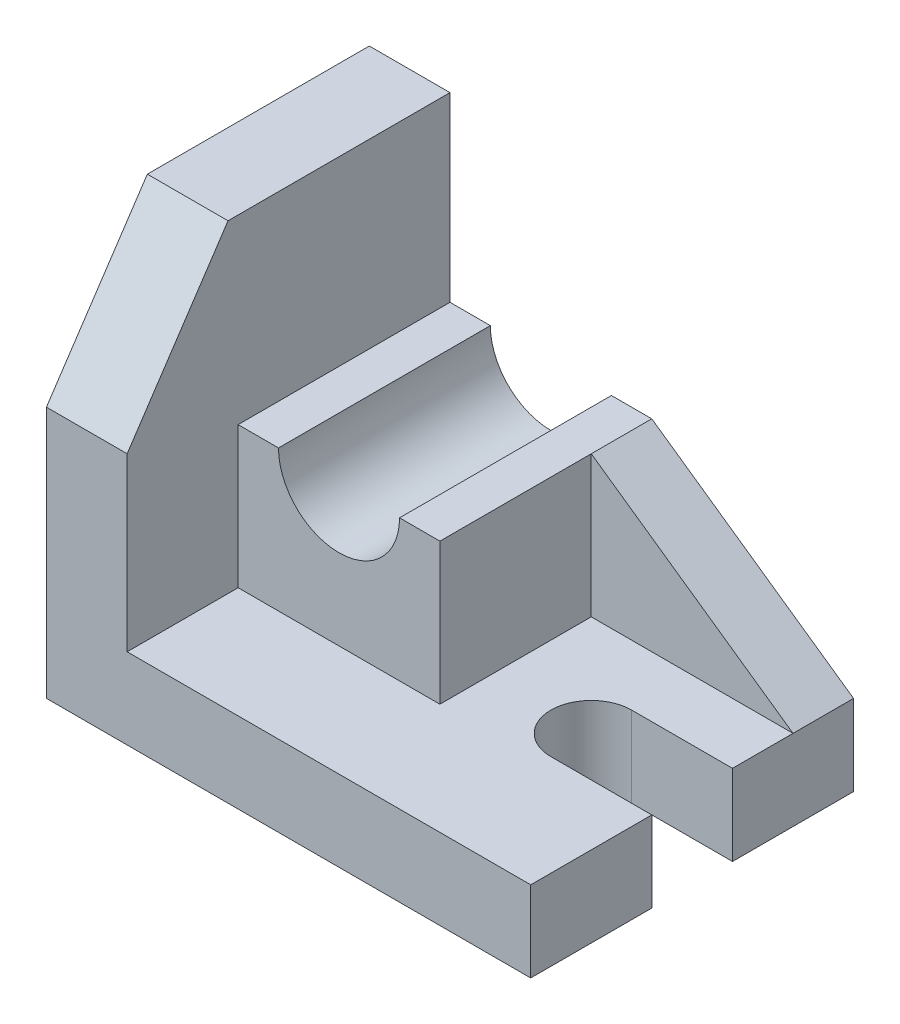
ISO-10303-21;
HEADER;
FILE_DESCRIPTION(('STEP AP214'),'2;1');
FILE_NAME('part.step','',(''),(''),'','','');
FILE_SCHEMA(('AUTOMOTIVE_DESIGN { 1 0 10303 214 1 1 1 1 }'));
ENDSEC;
DATA;
#1=APPLICATION_CONTEXT('core data for automotive mechanical design processes');
#2=APPLICATION_PROTOCOL_DEFINITION('international standard','automotive_design',2000,#1);
#3=PRODUCT_CONTEXT('',#1,'mechanical');
#4=PRODUCT('Part','Part','',(#3));
#5=PRODUCT_RELATED_PRODUCT_CATEGORY('part','',(#4));
#6=PRODUCT_DEFINITION_FORMATION('','',#4);
#7=PRODUCT_DEFINITION_CONTEXT('part definition',#1,'design');
#8=PRODUCT_DEFINITION('design','',#6,#7);
#9=PRODUCT_DEFINITION_SHAPE('','',#8);
#10=(LENGTH_UNIT() NAMED_UNIT(*) SI_UNIT(.MILLI.,.METRE.));
#11=(NAMED_UNIT(*) PLANE_ANGLE_UNIT() SI_UNIT($,.RADIAN.));
#12=(NAMED_UNIT(*) SI_UNIT($,.STERADIAN.) SOLID_ANGLE_UNIT());
#13=UNCERTAINTY_MEASURE_WITH_UNIT(LENGTH_MEASURE(1.E-05),#10,'distance_accuracy_value','');
#14=(GEOMETRIC_REPRESENTATION_CONTEXT(3) GLOBAL_UNCERTAINTY_ASSIGNED_CONTEXT((#13)) GLOBAL_UNIT_ASSIGNED_CONTEXT((#10,
#11,#12)) REPRESENTATION_CONTEXT('',''));
#15=CARTESIAN_POINT('',(0.,0.,0.));
#16=DIRECTION('',(0.,0.,1.));
#17=DIRECTION('',(1.,0.,0.));
#18=AXIS2_PLACEMENT_3D('',#15,#16,#17);
#19=CARTESIAN_POINT('',(0.,16.,0.));
#20=DIRECTION('',(0.,-1.,0.));
#21=DIRECTION('',(0.,0.,-1.));
#22=AXIS2_PLACEMENT_3D('',#19,#20,#21);
#23=PLANE('',#22);
#24=DIRECTION('',(-1.,0.,0.));
#25=VECTOR('',#24,1.);
#26=CARTESIAN_POINT('',(-17.2205345771136,16.,-19.3610159427443));
#27=LINE('',#26,#25);
#28=CARTESIAN_POINT('',(22.7794654228864,16.,-19.3610159427443));
#29=VERTEX_POINT('',#28);
#30=CARTESIAN_POINT('',(-17.2205345771136,16.,-19.3610159427443));
#31=VERTEX_POINT('',#30);
#32=EDGE_CURVE('E168',#29,#31,#27,.T.);
#33=ORIENTED_EDGE('',*,*,#32,.T.);
#34=DIRECTION('',(0.,0.,-1.));
#35=VECTOR('',#34,1.);
#36=CARTESIAN_POINT('',(-17.2205345771136,16.,10.6389840572557));
#37=LINE('',#36,#35);
#38=CARTESIAN_POINT('',(-17.2205345771136,16.,10.6389840572557));
#39=VERTEX_POINT('',#38);
#40=EDGE_CURVE('E180',#39,#31,#37,.T.);
#41=ORIENTED_EDGE('',*,*,#40,.F.);
#42=DIRECTION('',(-1.,0.,0.));
#43=VECTOR('',#42,1.);
#44=CARTESIAN_POINT('',(-17.2205345771136,16.,10.6389840572557));
#45=LINE('',#44,#43);
#46=CARTESIAN_POINT('',(-57.2205345771136,16.,10.6389840572557));
#47=VERTEX_POINT('',#46);
#48=EDGE_CURVE('E319',#39,#47,#45,.T.);
#49=ORIENTED_EDGE('',*,*,#48,.T.);
#50=DIRECTION('',(0.,0.,1.));
#51=VECTOR('',#50,1.);
#52=CARTESIAN_POINT('',(-57.2205345771136,16.,-31.3610159427443));
#53=LINE('',#52,#51);
#54=CARTESIAN_POINT('',(-57.2205345771136,16.,32.6389840572558));
#55=VERTEX_POINT('',#54);
#56=EDGE_CURVE('E203',#47,#55,#53,.T.);
#57=ORIENTED_EDGE('',*,*,#56,.T.);
#58=DIRECTION('',(1.,0.,0.));
#59=VECTOR('',#58,1.);
#60=CARTESIAN_POINT('',(22.7794654228864,16.,32.6389840572557));
#61=LINE('',#60,#59);
#62=CARTESIAN_POINT('',(22.7794654228864,16.,32.6389840572557));
#63=VERTEX_POINT('',#62);
#64=EDGE_CURVE('E247',#55,#63,#61,.T.);
#65=ORIENTED_EDGE('',*,*,#64,.T.);
#66=DIRECTION('',(0.,0.,-1.));
#67=VECTOR('',#66,1.);
#68=CARTESIAN_POINT('',(22.7794654228864,16.,-31.3610159427443));
#69=LINE('',#68,#67);
#70=CARTESIAN_POINT('',(22.7794654228864,16.,8.63898405725575));
#71=VERTEX_POINT('',#70);
#72=EDGE_CURVE('E250',#63,#71,#69,.T.);
#73=ORIENTED_EDGE('',*,*,#72,.T.);
#74=DIRECTION('',(1.,0.,0.));
#75=VECTOR('',#74,1.);
#76=CARTESIAN_POINT('',(22.7794654228864,16.,8.63898405725575));
#77=LINE('',#76,#75);
#78=CARTESIAN_POINT('',(2.77946542288637,16.,8.63898405725575));
#79=VERTEX_POINT('',#78);
#80=EDGE_CURVE('E225',#79,#71,#77,.T.);
#81=ORIENTED_EDGE('',*,*,#80,.F.);
#82=CARTESIAN_POINT('',(2.77946542288636,16.,0.63898405725575));
#83=DIRECTION('',(0.,1.,0.));
#84=DIRECTION('',(0.,0.,1.));
#85=AXIS2_PLACEMENT_3D('',#82,#83,#84);
#86=CIRCLE('',#85,8.);
#87=CARTESIAN_POINT('',(2.77946542288637,16.,-7.36101594274425));
#88=VERTEX_POINT('',#87);
#89=EDGE_CURVE('E234',#88,#79,#86,.T.);
#90=ORIENTED_EDGE('',*,*,#89,.F.);
#91=DIRECTION('',(-1.,0.,0.));
#92=VECTOR('',#91,1.);
#93=CARTESIAN_POINT('',(22.7794654228864,16.,-7.36101594274425));
#94=LINE('',#93,#92);
#95=CARTESIAN_POINT('',(22.7794654228864,16.,-7.36101594274425));
#96=VERTEX_POINT('',#95);
#97=EDGE_CURVE('E218',#96,#88,#94,.T.);
#98=ORIENTED_EDGE('',*,*,#97,.F.);
#99=EDGE_CURVE('E183',#96,#29,#69,.T.);
#100=ORIENTED_EDGE('',*,*,#99,.T.);
#101=EDGE_LOOP('',(#33,#41,#49,#57,#65,#73,#81,#90,#98,#100));
#102=FACE_BOUND('',#101,.T.);
#103=ADVANCED_FACE('F39',(#102),#23,.F.);
#104=CARTESIAN_POINT('',(-17.2205345771136,44.,10.6389840572557));
#105=DIRECTION('',(1.,0.,0.));
#106=DIRECTION('',(0.,1.,0.));
#107=AXIS2_PLACEMENT_3D('',#104,#105,#106);
#108=PLANE('',#107);
#109=ORIENTED_EDGE('',*,*,#40,.T.);
#110=DIRECTION('',(0.,1.,0.));
#111=VECTOR('',#110,1.);
#112=CARTESIAN_POINT('',(-17.2205345771136,44.,-19.3610159427443));
#113=LINE('',#112,#111);
#114=CARTESIAN_POINT('',(-17.2205345771136,44.,-19.3610159427443));
#115=VERTEX_POINT('',#114);
#116=EDGE_CURVE('E165',#31,#115,#113,.T.);
#117=ORIENTED_EDGE('',*,*,#116,.T.);
#118=DIRECTION('',(0.,0.,-1.));
#119=VECTOR('',#118,1.);
#120=CARTESIAN_POINT('',(-17.2205345771136,44.,10.6389840572557));
#121=LINE('',#120,#119);
#122=CARTESIAN_POINT('',(-17.2205345771136,44.,10.6389840572557));
#123=VERTEX_POINT('',#122);
#124=EDGE_CURVE('E191',#123,#115,#121,.T.);
#125=ORIENTED_EDGE('',*,*,#124,.F.);
#126=DIRECTION('',(0.,-1.,0.));
#127=VECTOR('',#126,1.);
#128=CARTESIAN_POINT('',(-17.2205345771136,44.,10.6389840572557));
#129=LINE('',#128,#127);
#130=EDGE_CURVE('E189',#123,#39,#129,.T.);
#131=ORIENTED_EDGE('',*,*,#130,.T.);
#132=EDGE_LOOP('',(#109,#117,#125,#131));
#133=FACE_BOUND('',#132,.T.);
#134=ADVANCED_FACE('F187',(#133),#108,.T.);
#135=CARTESIAN_POINT('',(-57.2205345771136,44.,10.6389840572557));
#136=DIRECTION('',(0.,1.,0.));
#137=DIRECTION('',(-1.,0.,0.));
#138=AXIS2_PLACEMENT_3D('',#135,#136,#137);
#139=PLANE('',#138);
#140=DIRECTION('',(0.,0.,1.));
#141=VECTOR('',#140,1.);
#142=CARTESIAN_POINT('',(-49.2205345771136,44.,-31.3610159427443));
#143=LINE('',#142,#141);
#144=CARTESIAN_POINT('',(-49.2205345771136,44.,-31.3610159427443));
#145=VERTEX_POINT('',#144);
#146=CARTESIAN_POINT('',(-49.2205345771136,44.,10.6389840572557));
#147=VERTEX_POINT('',#146);
#148=EDGE_CURVE('E55',#145,#147,#143,.T.);
#149=ORIENTED_EDGE('',*,*,#148,.F.);
#150=DIRECTION('',(1.,0.,0.));
#151=VECTOR('',#150,1.);
#152=CARTESIAN_POINT('',(-57.2205345771136,44.,-31.3610159427443));
#153=LINE('',#152,#151);
#154=CARTESIAN_POINT('',(-57.2205345771136,44.,-31.3610159427443));
#155=VERTEX_POINT('',#154);
#156=EDGE_CURVE('E198',#155,#145,#153,.T.);
#157=ORIENTED_EDGE('',*,*,#156,.F.);
#158=DIRECTION('',(0.,0.,-1.));
#159=VECTOR('',#158,1.);
#160=CARTESIAN_POINT('',(-57.2205345771136,44.,10.6389840572557));
#161=LINE('',#160,#159);
#162=CARTESIAN_POINT('',(-57.2205345771136,44.,10.6389840572557));
#163=VERTEX_POINT('',#162);
#164=EDGE_CURVE('E195',#163,#155,#161,.T.);
#165=ORIENTED_EDGE('',*,*,#164,.F.);
#166=DIRECTION('',(1.,0.,0.));
#167=VECTOR('',#166,1.);
#168=CARTESIAN_POINT('',(-57.2205345771136,44.,10.6389840572557));
#169=LINE('',#168,#167);
#170=EDGE_CURVE('E325',#163,#147,#169,.T.);
#171=ORIENTED_EDGE('',*,*,#170,.T.);
#172=EDGE_LOOP('',(#149,#157,#165,#171));
#173=FACE_BOUND('',#172,.T.);
#174=ADVANCED_FACE('F374',(#173),#139,.T.);
#175=CARTESIAN_POINT('',(-57.2205345771136,0.,0.));
#176=DIRECTION('',(-1.,0.,0.));
#177=DIRECTION('',(0.,0.,1.));
#178=AXIS2_PLACEMENT_3D('',#175,#176,#177);
#179=PLANE('',#178);
#180=DIRECTION('',(0.,1.,0.));
#181=VECTOR('',#180,1.);
#182=CARTESIAN_POINT('',(-57.2205345771136,16.,10.6389840572557));
#183=LINE('',#182,#181);
#184=EDGE_CURVE('E320',#47,#163,#183,.T.);
#185=ORIENTED_EDGE('',*,*,#184,.T.);
#186=ORIENTED_EDGE('',*,*,#164,.T.);
#187=DIRECTION('',(0.,1.,0.));
#188=VECTOR('',#187,1.);
#189=CARTESIAN_POINT('',(-57.2205345771136,16.,-31.3610159427443));
#190=LINE('',#189,#188);
#191=CARTESIAN_POINT('',(-57.2205345771136,16.,-31.3610159427443));
#192=VERTEX_POINT('',#191);
#193=EDGE_CURVE('E331',#192,#155,#190,.T.);
#194=ORIENTED_EDGE('',*,*,#193,.F.);
#195=DIRECTION('',(0.,-0.999999999872065,1.59959319801477E-05));
#196=VECTOR('',#195,1.);
#197=CARTESIAN_POINT('',(-57.2205345771136,80.,-31.3620396823911));
#198=LINE('',#197,#196);
#199=CARTESIAN_POINT('',(-57.2205345771136,80.,-31.3620396823911));
#200=VERTEX_POINT('',#199);
#201=EDGE_CURVE('E210',#200,#192,#198,.T.);
#202=ORIENTED_EDGE('',*,*,#201,.F.);
#203=DIRECTION('',(0.,0.,-1.));
#204=VECTOR('',#203,1.);
#205=CARTESIAN_POINT('',(-57.2205345771136,80.,32.6389840572558));
#206=LINE('',#205,#204);
#207=CARTESIAN_POINT('',(-57.2205345771136,80.,12.6389840572557));
#208=VERTEX_POINT('',#207);
#209=EDGE_CURVE('E208',#208,#200,#206,.T.);
#210=ORIENTED_EDGE('',*,*,#209,.F.);
#211=DIRECTION('',(0.,-0.832050294337844,0.554700196225228));
#212=VECTOR('',#211,1.);
#213=CARTESIAN_POINT('',(-57.2205345771136,49.9999999999999,32.6389840572557));
#214=LINE('',#213,#212);
#215=CARTESIAN_POINT('',(-57.2205345771136,49.9999999999998,32.6389840572558));
#216=VERTEX_POINT('',#215);
#217=EDGE_CURVE('E48',#208,#216,#214,.T.);
#218=ORIENTED_EDGE('',*,*,#217,.T.);
#219=DIRECTION('',(0.,1.,0.));
#220=VECTOR('',#219,1.);
#221=CARTESIAN_POINT('',(-57.2205345771136,16.,32.6389840572558));
#222=LINE('',#221,#220);
#223=EDGE_CURVE('E205',#55,#216,#222,.T.);
#224=ORIENTED_EDGE('',*,*,#223,.F.);
#225=ORIENTED_EDGE('',*,*,#56,.F.);
#226=EDGE_LOOP('',(#185,#186,#194,#202,#210,#218,#224,#225));
#227=FACE_BOUND('',#226,.T.);
#228=ADVANCED_FACE('F282',(#227),#179,.F.);
#229=CARTESIAN_POINT('',(22.7794654228864,16.,-31.3610159427443));
#230=DIRECTION('',(-1.,0.,0.));
#231=DIRECTION('',(0.,0.,1.));
#232=AXIS2_PLACEMENT_3D('',#229,#230,#231);
#233=PLANE('',#232);
#234=DIRECTION('',(0.,0.,-1.));
#235=VECTOR('',#234,1.);
#236=CARTESIAN_POINT('',(22.7794654228864,0.,-31.3610159427443));
#237=LINE('',#236,#235);
#238=CARTESIAN_POINT('',(22.7794654228864,0.,32.6389840572557));
#239=VERTEX_POINT('',#238);
#240=CARTESIAN_POINT('',(22.7794654228864,0.,8.63898405725575));
#241=VERTEX_POINT('',#240);
#242=EDGE_CURVE('E259',#239,#241,#237,.T.);
#243=ORIENTED_EDGE('',*,*,#242,.T.);
#244=DIRECTION('',(0.,1.,0.));
#245=VECTOR('',#244,1.);
#246=CARTESIAN_POINT('',(22.7794654228864,0.,8.63898405725575));
#247=LINE('',#246,#245);
#248=EDGE_CURVE('E238',#241,#71,#247,.T.);
#249=ORIENTED_EDGE('',*,*,#248,.T.);
#250=ORIENTED_EDGE('',*,*,#72,.F.);
#251=DIRECTION('',(0.,-1.,0.));
#252=VECTOR('',#251,1.);
#253=CARTESIAN_POINT('',(22.7794654228864,16.,32.6389840572557));
#254=LINE('',#253,#252);
#255=EDGE_CURVE('E268',#63,#239,#254,.T.);
#256=ORIENTED_EDGE('',*,*,#255,.T.);
#257=EDGE_LOOP('',(#243,#249,#250,#256));
#258=FACE_BOUND('',#257,.T.);
#259=ADVANCED_FACE('F316',(#258),#233,.F.);
#260=CARTESIAN_POINT('',(-73.2205345771136,16.,32.6389840572558));
#261=DIRECTION('',(1.,0.,0.));
#262=DIRECTION('',(0.,0.,-1.));
#263=AXIS2_PLACEMENT_3D('',#260,#261,#262);
#264=PLANE('',#263);
#265=DIRECTION('',(0.,-1.,0.));
#266=VECTOR('',#265,1.);
#267=CARTESIAN_POINT('',(-73.2205345771136,16.,32.6389840572558));
#268=LINE('',#267,#266);
#269=CARTESIAN_POINT('',(-73.2205345771136,49.9999999999998,32.6389840572558));
#270=VERTEX_POINT('',#269);
#271=CARTESIAN_POINT('',(-73.2205345771136,0.,32.6389840572558));
#272=VERTEX_POINT('',#271);
#273=EDGE_CURVE('E271',#270,#272,#268,.T.);
#274=ORIENTED_EDGE('',*,*,#273,.F.);
#275=DIRECTION('',(0.,0.832050294337844,-0.554700196225228));
#276=VECTOR('',#275,1.);
#277=CARTESIAN_POINT('',(-73.2205345771136,49.9999999999999,32.6389840572557));
#278=LINE('',#277,#276);
#279=CARTESIAN_POINT('',(-73.2205345771136,80.,12.6389840572557));
#280=VERTEX_POINT('',#279);
#281=EDGE_CURVE('E276',#270,#280,#278,.T.);
#282=ORIENTED_EDGE('',*,*,#281,.T.);
#283=DIRECTION('',(0.,0.,-1.));
#284=VECTOR('',#283,1.);
#285=CARTESIAN_POINT('',(-73.2205345771136,80.,32.6389840572558));
#286=LINE('',#285,#284);
#287=CARTESIAN_POINT('',(-73.2205345771136,80.,-31.3620396823911));
#288=VERTEX_POINT('',#287);
#289=EDGE_CURVE('E190',#280,#288,#286,.T.);
#290=ORIENTED_EDGE('',*,*,#289,.T.);
#291=DIRECTION('',(0.,-0.999999999872065,1.59959319801477E-05));
#292=VECTOR('',#291,1.);
#293=CARTESIAN_POINT('',(-73.2205345771136,80.,-31.3620396823911));
#294=LINE('',#293,#292);
#295=CARTESIAN_POINT('',(-73.2205345771136,16.,-31.3610159427443));
#296=VERTEX_POINT('',#295);
#297=EDGE_CURVE('E193',#288,#296,#294,.T.);
#298=ORIENTED_EDGE('',*,*,#297,.T.);
#299=DIRECTION('',(0.,-1.,0.));
#300=VECTOR('',#299,1.);
#301=CARTESIAN_POINT('',(-73.2205345771136,16.,-31.3610159427443));
#302=LINE('',#301,#300);
#303=CARTESIAN_POINT('',(-73.2205345771136,0.,-31.3610159427443));
#304=VERTEX_POINT('',#303);
#305=EDGE_CURVE('E253',#296,#304,#302,.T.);
#306=ORIENTED_EDGE('',*,*,#305,.T.);
#307=DIRECTION('',(0.,0.,1.));
#308=VECTOR('',#307,1.);
#309=CARTESIAN_POINT('',(-73.2205345771136,0.,32.6389840572558));
#310=LINE('',#309,#308);
#311=EDGE_CURVE('E241',#304,#272,#310,.T.);
#312=ORIENTED_EDGE('',*,*,#311,.T.);
#313=EDGE_LOOP('',(#274,#282,#290,#298,#306,#312));
#314=FACE_BOUND('',#313,.T.);
#315=ADVANCED_FACE('F293',(#314),#264,.F.);
#316=CARTESIAN_POINT('',(22.7794654228864,16.,32.6389840572557));
#317=DIRECTION('',(0.,0.,-1.));
#318=DIRECTION('',(-1.,0.,0.));
#319=AXIS2_PLACEMENT_3D('',#316,#317,#318);
#320=PLANE('',#319);
#321=ORIENTED_EDGE('',*,*,#223,.T.);
#322=DIRECTION('',(-1.,0.,0.));
#323=VECTOR('',#322,1.);
#324=CARTESIAN_POINT('',(-73.2205345771136,49.9999999999998,32.6389840572558));
#325=LINE('',#324,#323);
#326=EDGE_CURVE('E273',#216,#270,#325,.T.);
#327=ORIENTED_EDGE('',*,*,#326,.T.);
#328=ORIENTED_EDGE('',*,*,#273,.T.);
#329=DIRECTION('',(1.,0.,0.));
#330=VECTOR('',#329,1.);
#331=CARTESIAN_POINT('',(22.7794654228864,0.,32.6389840572557));
#332=LINE('',#331,#330);
#333=EDGE_CURVE('E256',#272,#239,#332,.T.);
#334=ORIENTED_EDGE('',*,*,#333,.T.);
#335=ORIENTED_EDGE('',*,*,#255,.F.);
#336=ORIENTED_EDGE('',*,*,#64,.F.);
#337=EDGE_LOOP('',(#321,#327,#328,#334,#335,#336));
#338=FACE_BOUND('',#337,.T.);
#339=ADVANCED_FACE('F289',(#338),#320,.F.);
#340=ORIENTED_EDGE('',*,*,#99,.F.);
#341=DIRECTION('',(0.,1.,0.));
#342=VECTOR('',#341,1.);
#343=CARTESIAN_POINT('',(22.7794654228864,0.,-7.36101594274425));
#344=LINE('',#343,#342);
#345=CARTESIAN_POINT('',(22.7794654228864,0.,-7.36101594274425));
#346=VERTEX_POINT('',#345);
#347=EDGE_CURVE('E231',#346,#96,#344,.T.);
#348=ORIENTED_EDGE('',*,*,#347,.F.);
#349=CARTESIAN_POINT('',(22.7794654228864,0.,-31.3610159427443));
#350=VERTEX_POINT('',#349);
#351=EDGE_CURVE('E258',#346,#350,#237,.T.);
#352=ORIENTED_EDGE('',*,*,#351,.T.);
#353=DIRECTION('',(0.,-1.,0.));
#354=VECTOR('',#353,1.);
#355=CARTESIAN_POINT('',(22.7794654228864,16.,-31.3610159427443));
#356=LINE('',#355,#354);
#357=CARTESIAN_POINT('',(22.7794654228864,16.,-31.3610159427443));
#358=VERTEX_POINT('',#357);
#359=EDGE_CURVE('E265',#358,#350,#356,.T.);
#360=ORIENTED_EDGE('',*,*,#359,.F.);
#361=DIRECTION('',(0.,0.,-1.));
#362=VECTOR('',#361,1.);
#363=CARTESIAN_POINT('',(22.7794654228864,16.,-19.3610159427443));
#364=LINE('',#363,#362);
#365=EDGE_CURVE('E340',#29,#358,#364,.T.);
#366=ORIENTED_EDGE('',*,*,#365,.F.);
#367=EDGE_LOOP('',(#340,#348,#352,#360,#366));
#368=FACE_BOUND('',#367,.T.);
#369=ADVANCED_FACE('F350',(#368),#233,.F.);
#370=CARTESIAN_POINT('',(-73.2205345771136,16.,-31.3610159427443));
#371=DIRECTION('',(0.,0.,1.));
#372=DIRECTION('',(1.,0.,0.));
#373=AXIS2_PLACEMENT_3D('',#370,#371,#372);
#374=PLANE('',#373);
#375=ORIENTED_EDGE('',*,*,#156,.T.);
#376=CARTESIAN_POINT('',(-37.2205345771136,44.,-31.3610159427443));
#377=DIRECTION('',(0.,0.,1.));
#378=DIRECTION('',(1.,0.,0.));
#379=AXIS2_PLACEMENT_3D('',#376,#377,#378);
#380=CIRCLE('',#379,12.);
#381=CARTESIAN_POINT('',(-25.2205345771136,44.,-31.3610159427443));
#382=VERTEX_POINT('',#381);
#383=EDGE_CURVE('E335',#145,#382,#380,.T.);
#384=ORIENTED_EDGE('',*,*,#383,.T.);
#385=CARTESIAN_POINT('',(-17.2205345771136,44.,-31.3610159427443));
#386=VERTEX_POINT('',#385);
#387=EDGE_CURVE('E332',#382,#386,#153,.T.);
#388=ORIENTED_EDGE('',*,*,#387,.T.);
#389=DIRECTION('',(0.81923192051904,-0.573462344363329,0.));
#390=VECTOR('',#389,1.);
#391=CARTESIAN_POINT('',(22.7794654228864,16.,-31.3610159427443));
#392=LINE('',#391,#390);
#393=EDGE_CURVE('E184',#386,#358,#392,.T.);
#394=ORIENTED_EDGE('',*,*,#393,.T.);
#395=ORIENTED_EDGE('',*,*,#359,.T.);
#396=DIRECTION('',(-1.,0.,0.));
#397=VECTOR('',#396,1.);
#398=CARTESIAN_POINT('',(-73.2205345771136,0.,-31.3610159427443));
#399=LINE('',#398,#397);
#400=EDGE_CURVE('E249',#350,#304,#399,.T.);
#401=ORIENTED_EDGE('',*,*,#400,.T.);
#402=ORIENTED_EDGE('',*,*,#305,.F.);
#403=DIRECTION('',(-1.,0.,0.));
#404=VECTOR('',#403,1.);
#405=CARTESIAN_POINT('',(-57.2205345771136,16.,-31.3610159427443));
#406=LINE('',#405,#404);
#407=EDGE_CURVE('E216',#192,#296,#406,.T.);
#408=ORIENTED_EDGE('',*,*,#407,.F.);
#409=ORIENTED_EDGE('',*,*,#193,.T.);
#410=EDGE_LOOP('',(#375,#384,#388,#394,#395,#401,#402,#408,#409));
#411=FACE_BOUND('',#410,.T.);
#412=ADVANCED_FACE('F304',(#411),#374,.F.);
#413=CARTESIAN_POINT('',(0.,0.,0.));
#414=DIRECTION('',(0.,-1.,0.));
#415=DIRECTION('',(0.,0.,-1.));
#416=AXIS2_PLACEMENT_3D('',#413,#414,#415);
#417=PLANE('',#416);
#418=DIRECTION('',(1.,0.,0.));
#419=VECTOR('',#418,1.);
#420=CARTESIAN_POINT('',(22.7794654228864,0.,8.63898405725575));
#421=LINE('',#420,#419);
#422=CARTESIAN_POINT('',(2.77946542288637,0.,8.63898405725575));
#423=VERTEX_POINT('',#422);
#424=EDGE_CURVE('E228',#423,#241,#421,.T.);
#425=ORIENTED_EDGE('',*,*,#424,.T.);
#426=ORIENTED_EDGE('',*,*,#242,.F.);
#427=ORIENTED_EDGE('',*,*,#333,.F.);
#428=ORIENTED_EDGE('',*,*,#311,.F.);
#429=ORIENTED_EDGE('',*,*,#400,.F.);
#430=ORIENTED_EDGE('',*,*,#351,.F.);
#431=DIRECTION('',(-1.,0.,0.));
#432=VECTOR('',#431,1.);
#433=CARTESIAN_POINT('',(22.7794654228864,0.,-7.36101594274425));
#434=LINE('',#433,#432);
#435=CARTESIAN_POINT('',(2.77946542288637,0.,-7.36101594274425));
#436=VERTEX_POINT('',#435);
#437=EDGE_CURVE('E221',#346,#436,#434,.T.);
#438=ORIENTED_EDGE('',*,*,#437,.T.);
#439=CARTESIAN_POINT('',(2.77946542288636,0.,0.63898405725575));
#440=DIRECTION('',(0.,1.,0.));
#441=DIRECTION('',(0.,0.,1.));
#442=AXIS2_PLACEMENT_3D('',#439,#440,#441);
#443=CIRCLE('',#442,8.);
#444=EDGE_CURVE('E224',#436,#423,#443,.T.);
#445=ORIENTED_EDGE('',*,*,#444,.T.);
#446=EDGE_LOOP('',(#425,#426,#427,#428,#429,#430,#438,#445));
#447=FACE_BOUND('',#446,.T.);
#448=ADVANCED_FACE('F311',(#447),#417,.T.);
#449=CARTESIAN_POINT('',(22.7794654228864,0.,8.63898405725575));
#450=DIRECTION('',(0.,0.,1.));
#451=DIRECTION('',(1.,0.,0.));
#452=AXIS2_PLACEMENT_3D('',#449,#450,#451);
#453=PLANE('',#452);
#454=ORIENTED_EDGE('',*,*,#80,.T.);
#455=ORIENTED_EDGE('',*,*,#248,.F.);
#456=ORIENTED_EDGE('',*,*,#424,.F.);
#457=DIRECTION('',(0.,1.,0.));
#458=VECTOR('',#457,1.);
#459=CARTESIAN_POINT('',(2.77946542288637,0.,8.63898405725575));
#460=LINE('',#459,#458);
#461=EDGE_CURVE('E242',#423,#79,#460,.T.);
#462=ORIENTED_EDGE('',*,*,#461,.T.);
#463=EDGE_LOOP('',(#454,#455,#456,#462));
#464=FACE_BOUND('',#463,.T.);
#465=ADVANCED_FACE('F359',(#464),#453,.F.);
#466=CARTESIAN_POINT('',(2.77946542288636,0.,0.63898405725575));
#467=DIRECTION('',(0.,1.,0.));
#468=DIRECTION('',(0.,0.,1.));
#469=AXIS2_PLACEMENT_3D('',#466,#467,#468);
#470=CYLINDRICAL_SURFACE('',#469,8.);
#471=ORIENTED_EDGE('',*,*,#89,.T.);
#472=ORIENTED_EDGE('',*,*,#461,.F.);
#473=ORIENTED_EDGE('',*,*,#444,.F.);
#474=DIRECTION('',(0.,1.,0.));
#475=VECTOR('',#474,1.);
#476=CARTESIAN_POINT('',(2.77946542288637,0.,-7.36101594274425));
#477=LINE('',#476,#475);
#478=EDGE_CURVE('E244',#436,#88,#477,.T.);
#479=ORIENTED_EDGE('',*,*,#478,.T.);
#480=EDGE_LOOP('',(#471,#472,#473,#479));
#481=FACE_BOUND('',#480,.T.);
#482=ADVANCED_FACE('F356',(#481),#470,.F.);
#483=CARTESIAN_POINT('',(22.7794654228864,0.,-7.36101594274425));
#484=DIRECTION('',(0.,0.,-1.));
#485=DIRECTION('',(-1.,0.,0.));
#486=AXIS2_PLACEMENT_3D('',#483,#484,#485);
#487=PLANE('',#486);
#488=ORIENTED_EDGE('',*,*,#97,.T.);
#489=ORIENTED_EDGE('',*,*,#478,.F.);
#490=ORIENTED_EDGE('',*,*,#437,.F.);
#491=ORIENTED_EDGE('',*,*,#347,.T.);
#492=EDGE_LOOP('',(#488,#489,#490,#491));
#493=FACE_BOUND('',#492,.T.);
#494=ADVANCED_FACE('F353',(#493),#487,.F.);
#495=CARTESIAN_POINT('',(-57.2205345771136,80.,-31.3620396823911));
#496=DIRECTION('',(0.,-1.59959319801477E-05,-0.999999999872065));
#497=DIRECTION('',(0.,0.999999999872065,-1.59959319801477E-05));
#498=AXIS2_PLACEMENT_3D('',#495,#496,#497);
#499=PLANE('',#498);
#500=ORIENTED_EDGE('',*,*,#297,.F.);
#501=DIRECTION('',(-1.,0.,0.));
#502=VECTOR('',#501,1.);
#503=CARTESIAN_POINT('',(-57.2205345771136,80.,-31.3620396823911));
#504=LINE('',#503,#502);
#505=EDGE_CURVE('E212',#200,#288,#504,.T.);
#506=ORIENTED_EDGE('',*,*,#505,.F.);
#507=ORIENTED_EDGE('',*,*,#201,.T.);
#508=ORIENTED_EDGE('',*,*,#407,.T.);
#509=EDGE_LOOP('',(#500,#506,#507,#508));
#510=FACE_BOUND('',#509,.T.);
#511=ADVANCED_FACE('F298',(#510),#499,.T.);
#512=CARTESIAN_POINT('',(-57.2205345771136,80.,32.6389840572558));
#513=DIRECTION('',(0.,1.,0.));
#514=DIRECTION('',(0.,0.,1.));
#515=AXIS2_PLACEMENT_3D('',#512,#513,#514);
#516=PLANE('',#515);
#517=ORIENTED_EDGE('',*,*,#289,.F.);
#518=DIRECTION('',(1.,0.,0.));
#519=VECTOR('',#518,1.);
#520=CARTESIAN_POINT('',(-57.2205345771136,80.,12.6389840572557));
#521=LINE('',#520,#519);
#522=EDGE_CURVE('E62',#280,#208,#521,.T.);
#523=ORIENTED_EDGE('',*,*,#522,.T.);
#524=ORIENTED_EDGE('',*,*,#209,.T.);
#525=ORIENTED_EDGE('',*,*,#505,.T.);
#526=EDGE_LOOP('',(#517,#523,#524,#525));
#527=FACE_BOUND('',#526,.T.);
#528=ADVANCED_FACE('F294',(#527),#516,.T.);
#529=CARTESIAN_POINT('',(22.7794654228864,49.9999999999998,32.6389840572557));
#530=DIRECTION('',(0.,0.554700196225228,0.832050294337844));
#531=DIRECTION('',(1.,0.,0.));
#532=AXIS2_PLACEMENT_3D('',#529,#530,#531);
#533=PLANE('',#532);
#534=ORIENTED_EDGE('',*,*,#217,.F.);
#535=ORIENTED_EDGE('',*,*,#522,.F.);
#536=ORIENTED_EDGE('',*,*,#281,.F.);
#537=ORIENTED_EDGE('',*,*,#326,.F.);
#538=EDGE_LOOP('',(#534,#535,#536,#537));
#539=FACE_BOUND('',#538,.T.);
#540=ADVANCED_FACE('F42',(#539),#533,.T.);
#541=DIRECTION('',(0.,0.,1.));
#542=VECTOR('',#541,1.);
#543=CARTESIAN_POINT('',(-25.2205345771136,44.,-31.3610159427443));
#544=LINE('',#543,#542);
#545=CARTESIAN_POINT('',(-25.2205345771136,44.,10.6389840572557));
#546=VERTEX_POINT('',#545);
#547=EDGE_CURVE('E334',#546,#382,#544,.F.);
#548=ORIENTED_EDGE('',*,*,#547,.F.);
#549=EDGE_CURVE('E323',#546,#123,#169,.T.);
#550=ORIENTED_EDGE('',*,*,#549,.T.);
#551=ORIENTED_EDGE('',*,*,#124,.T.);
#552=DIRECTION('',(0.,0.,-1.));
#553=VECTOR('',#552,1.);
#554=CARTESIAN_POINT('',(-17.2205345771136,44.,-19.3610159427443));
#555=LINE('',#554,#553);
#556=EDGE_CURVE('E341',#115,#386,#555,.T.);
#557=ORIENTED_EDGE('',*,*,#556,.T.);
#558=ORIENTED_EDGE('',*,*,#387,.F.);
#559=EDGE_LOOP('',(#548,#550,#551,#557,#558));
#560=FACE_BOUND('',#559,.T.);
#561=ADVANCED_FACE('F396',(#560),#139,.T.);
#562=CARTESIAN_POINT('',(0.,0.,10.6389840572557));
#563=DIRECTION('',(0.,0.,-1.));
#564=DIRECTION('',(-1.,0.,0.));
#565=AXIS2_PLACEMENT_3D('',#562,#563,#564);
#566=PLANE('',#565);
#567=ORIENTED_EDGE('',*,*,#549,.F.);
#568=CARTESIAN_POINT('',(-37.2205345771136,44.,10.6389840572557));
#569=DIRECTION('',(0.,0.,-1.));
#570=DIRECTION('',(-1.,0.,0.));
#571=AXIS2_PLACEMENT_3D('',#568,#569,#570);
#572=CIRCLE('',#571,12.);
#573=EDGE_CURVE('E11',#546,#147,#572,.T.);
#574=ORIENTED_EDGE('',*,*,#573,.T.);
#575=ORIENTED_EDGE('',*,*,#170,.F.);
#576=ORIENTED_EDGE('',*,*,#184,.F.);
#577=ORIENTED_EDGE('',*,*,#48,.F.);
#578=ORIENTED_EDGE('',*,*,#130,.F.);
#579=EDGE_LOOP('',(#567,#574,#575,#576,#577,#578));
#580=FACE_BOUND('',#579,.T.);
#581=ADVANCED_FACE('F406',(#580),#566,.F.);
#582=CARTESIAN_POINT('',(-37.2205345771136,44.,-31.3610159427443));
#583=DIRECTION('',(0.,0.,1.));
#584=DIRECTION('',(1.,0.,0.));
#585=AXIS2_PLACEMENT_3D('',#582,#583,#584);
#586=CYLINDRICAL_SURFACE('',#585,12.);
#587=ORIENTED_EDGE('',*,*,#148,.T.);
#588=ORIENTED_EDGE('',*,*,#573,.F.);
#589=ORIENTED_EDGE('',*,*,#547,.T.);
#590=ORIENTED_EDGE('',*,*,#383,.F.);
#591=EDGE_LOOP('',(#587,#588,#589,#590));
#592=FACE_BOUND('',#591,.T.);
#593=ADVANCED_FACE('F411',(#592),#586,.F.);
#594=CARTESIAN_POINT('',(22.7794654228864,16.,-19.3610159427443));
#595=DIRECTION('',(0.573462344363329,0.81923192051904,0.));
#596=DIRECTION('',(-0.81923192051904,0.573462344363329,0.));
#597=AXIS2_PLACEMENT_3D('',#594,#595,#596);
#598=PLANE('',#597);
#599=ORIENTED_EDGE('',*,*,#393,.F.);
#600=ORIENTED_EDGE('',*,*,#556,.F.);
#601=DIRECTION('',(0.81923192051904,-0.573462344363329,0.));
#602=VECTOR('',#601,1.);
#603=CARTESIAN_POINT('',(22.7794654228864,16.,-19.3610159427443));
#604=LINE('',#603,#602);
#605=EDGE_CURVE('E170',#115,#29,#604,.T.);
#606=ORIENTED_EDGE('',*,*,#605,.T.);
#607=ORIENTED_EDGE('',*,*,#365,.T.);
#608=EDGE_LOOP('',(#599,#600,#606,#607));
#609=FACE_BOUND('',#608,.T.);
#610=ADVANCED_FACE('F348',(#609),#598,.T.);
#611=CARTESIAN_POINT('',(0.,0.,-19.3610159427443));
#612=DIRECTION('',(0.,0.,-1.));
#613=DIRECTION('',(-1.,0.,0.));
#614=AXIS2_PLACEMENT_3D('',#611,#612,#613);
#615=PLANE('',#614);
#616=ORIENTED_EDGE('',*,*,#32,.F.);
#617=ORIENTED_EDGE('',*,*,#605,.F.);
#618=ORIENTED_EDGE('',*,*,#116,.F.);
#619=EDGE_LOOP('',(#616,#617,#618));
#620=FACE_BOUND('',#619,.T.);
#621=ADVANCED_FACE('F167',(#620),#615,.F.);
#622=CLOSED_SHELL('',(#103,#134,#174,#228,#259,#315,#339,#369,#412,#448,#465,#482,#494,#511,
#528,#540,#561,#581,#593,#610,#621));
#623=MANIFOLD_SOLID_BREP('B2',#622);
#624=ADVANCED_BREP_SHAPE_REPRESENTATION('',(#18,#623),#14);
#625=SHAPE_DEFINITION_REPRESENTATION(#9,#624);
ENDSEC;
END-ISO-10303-21;
